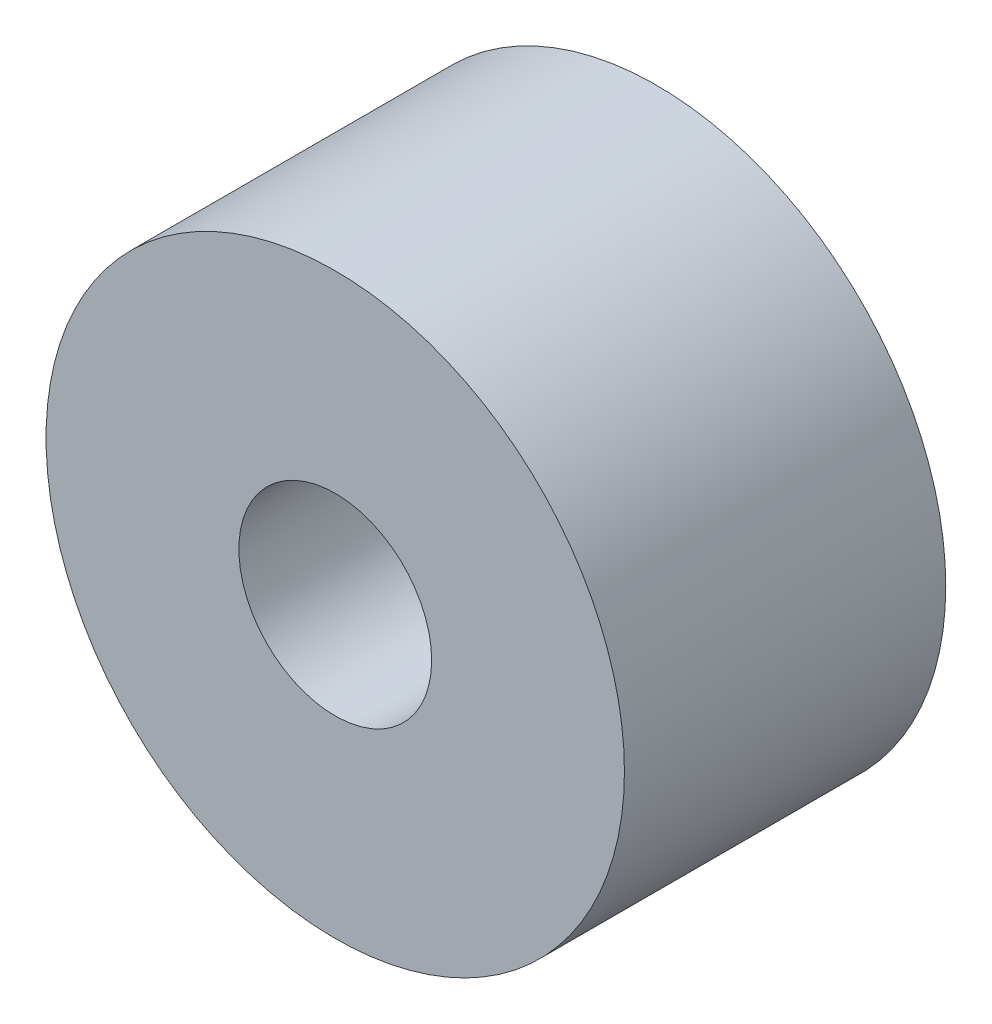
ISO-10303-21;
HEADER;
FILE_DESCRIPTION(('STEP AP214'),'2;1');
FILE_NAME('part.step','',(''),(''),'','','');
FILE_SCHEMA(('AUTOMOTIVE_DESIGN { 1 0 10303 214 1 1 1 1 }'));
ENDSEC;
DATA;
#1=APPLICATION_CONTEXT('core data for automotive mechanical design processes');
#2=APPLICATION_PROTOCOL_DEFINITION('international standard','automotive_design',2000,#1);
#3=PRODUCT_CONTEXT('',#1,'mechanical');
#4=PRODUCT('Part','Part','',(#3));
#5=PRODUCT_RELATED_PRODUCT_CATEGORY('part','',(#4));
#6=PRODUCT_DEFINITION_FORMATION('','',#4);
#7=PRODUCT_DEFINITION_CONTEXT('part definition',#1,'design');
#8=PRODUCT_DEFINITION('design','',#6,#7);
#9=PRODUCT_DEFINITION_SHAPE('','',#8);
#10=(LENGTH_UNIT() NAMED_UNIT(*) SI_UNIT(.MILLI.,.METRE.));
#11=(NAMED_UNIT(*) PLANE_ANGLE_UNIT() SI_UNIT($,.RADIAN.));
#12=(NAMED_UNIT(*) SI_UNIT($,.STERADIAN.) SOLID_ANGLE_UNIT());
#13=UNCERTAINTY_MEASURE_WITH_UNIT(LENGTH_MEASURE(1.E-05),#10,'distance_accuracy_value','');
#14=(GEOMETRIC_REPRESENTATION_CONTEXT(3) GLOBAL_UNCERTAINTY_ASSIGNED_CONTEXT((#13)) GLOBAL_UNIT_ASSIGNED_CONTEXT((#10,
#11,#12)) REPRESENTATION_CONTEXT('',''));
#15=CARTESIAN_POINT('',(0.,0.,0.));
#16=DIRECTION('',(0.,0.,1.));
#17=DIRECTION('',(1.,0.,0.));
#18=AXIS2_PLACEMENT_3D('',#15,#16,#17);
#19=CARTESIAN_POINT('',(0.,0.,5.));
#20=DIRECTION('',(0.,0.,1.));
#21=DIRECTION('',(1.,0.,0.));
#22=AXIS2_PLACEMENT_3D('',#19,#20,#21);
#23=PLANE('',#22);
#24=CARTESIAN_POINT('',(0.,0.,5.));
#25=DIRECTION('',(0.,0.,1.));
#26=DIRECTION('',(1.,0.,0.));
#27=AXIS2_PLACEMENT_3D('',#24,#25,#26);
#28=CIRCLE('',#27,4.5);
#29=CARTESIAN_POINT('',(4.5,0.,5.));
#30=VERTEX_POINT('',#29);
#31=EDGE_CURVE('E10',#30,#30,#28,.T.);
#32=ORIENTED_EDGE('',*,*,#31,.T.);
#33=EDGE_LOOP('',(#32));
#34=FACE_BOUND('',#33,.T.);
#35=CARTESIAN_POINT('',(0.,0.,5.));
#36=DIRECTION('',(0.,0.,1.));
#37=DIRECTION('',(1.,0.,0.));
#38=AXIS2_PLACEMENT_3D('',#35,#36,#37);
#39=CIRCLE('',#38,1.5);
#40=CARTESIAN_POINT('',(1.5,0.,5.));
#41=VERTEX_POINT('',#40);
#42=EDGE_CURVE('E43',#41,#41,#39,.T.);
#43=ORIENTED_EDGE('',*,*,#42,.F.);
#44=EDGE_LOOP('',(#43));
#45=FACE_BOUND('',#44,.T.);
#46=ADVANCED_FACE('F32',(#34,#45),#23,.T.);
#47=CARTESIAN_POINT('',(0.,0.,0.));
#48=DIRECTION('',(0.,0.,1.));
#49=DIRECTION('',(1.,0.,0.));
#50=AXIS2_PLACEMENT_3D('',#47,#48,#49);
#51=PLANE('',#50);
#52=CARTESIAN_POINT('',(0.,0.,0.));
#53=DIRECTION('',(0.,0.,1.));
#54=DIRECTION('',(1.,0.,0.));
#55=AXIS2_PLACEMENT_3D('',#52,#53,#54);
#56=CIRCLE('',#55,4.5);
#57=CARTESIAN_POINT('',(4.5,0.,0.));
#58=VERTEX_POINT('',#57);
#59=EDGE_CURVE('E36',#58,#58,#56,.T.);
#60=ORIENTED_EDGE('',*,*,#59,.F.);
#61=EDGE_LOOP('',(#60));
#62=FACE_BOUND('',#61,.T.);
#63=CARTESIAN_POINT('',(0.,0.,0.));
#64=DIRECTION('',(0.,0.,1.));
#65=DIRECTION('',(1.,0.,0.));
#66=AXIS2_PLACEMENT_3D('',#63,#64,#65);
#67=CIRCLE('',#66,1.5);
#68=CARTESIAN_POINT('',(1.5,0.,0.));
#69=VERTEX_POINT('',#68);
#70=EDGE_CURVE('E45',#69,#69,#67,.T.);
#71=ORIENTED_EDGE('',*,*,#70,.T.);
#72=EDGE_LOOP('',(#71));
#73=FACE_BOUND('',#72,.T.);
#74=ADVANCED_FACE('F55',(#62,#73),#51,.F.);
#75=CARTESIAN_POINT('',(0.,0.,5.));
#76=DIRECTION('',(0.,0.,-1.));
#77=DIRECTION('',(-1.,0.,0.));
#78=AXIS2_PLACEMENT_3D('',#75,#76,#77);
#79=CYLINDRICAL_SURFACE('',#78,4.5);
#80=ORIENTED_EDGE('',*,*,#31,.F.);
#81=EDGE_LOOP('',(#80));
#82=FACE_BOUND('',#81,.T.);
#83=ORIENTED_EDGE('',*,*,#59,.T.);
#84=EDGE_LOOP('',(#83));
#85=FACE_BOUND('',#84,.T.);
#86=ADVANCED_FACE('F34',(#82,#85),#79,.T.);
#87=CARTESIAN_POINT('',(0.,0.,5.));
#88=DIRECTION('',(0.,0.,-1.));
#89=DIRECTION('',(-1.,0.,0.));
#90=AXIS2_PLACEMENT_3D('',#87,#88,#89);
#91=CYLINDRICAL_SURFACE('',#90,1.5);
#92=ORIENTED_EDGE('',*,*,#42,.T.);
#93=EDGE_LOOP('',(#92));
#94=FACE_BOUND('',#93,.T.);
#95=ORIENTED_EDGE('',*,*,#70,.F.);
#96=EDGE_LOOP('',(#95));
#97=FACE_BOUND('',#96,.T.);
#98=ADVANCED_FACE('F51',(#94,#97),#91,.F.);
#99=CLOSED_SHELL('',(#46,#74,#86,#98));
#100=MANIFOLD_SOLID_BREP('B2',#99);
#101=ADVANCED_BREP_SHAPE_REPRESENTATION('',(#18,#100),#14);
#102=SHAPE_DEFINITION_REPRESENTATION(#9,#101);
ENDSEC;
END-ISO-10303-21;
